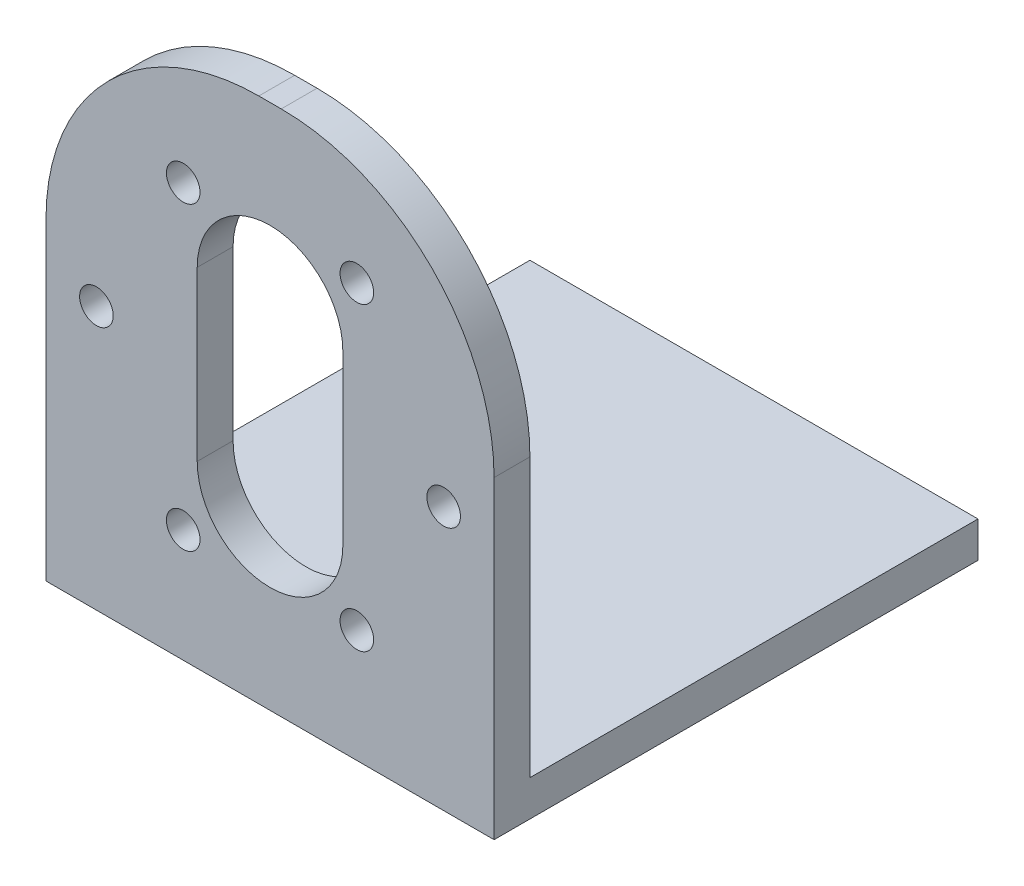
ISO-10303-21;
HEADER;
FILE_DESCRIPTION(('STEP AP214'),'2;1');
FILE_NAME('part.step','',(''),(''),'','','');
FILE_SCHEMA(('AUTOMOTIVE_DESIGN { 1 0 10303 214 1 1 1 1 }'));
ENDSEC;
DATA;
#1=APPLICATION_CONTEXT('core data for automotive mechanical design processes');
#2=APPLICATION_PROTOCOL_DEFINITION('international standard','automotive_design',2000,#1);
#3=PRODUCT_CONTEXT('',#1,'mechanical');
#4=PRODUCT('Part','Part','',(#3));
#5=PRODUCT_RELATED_PRODUCT_CATEGORY('part','',(#4));
#6=PRODUCT_DEFINITION_FORMATION('','',#4);
#7=PRODUCT_DEFINITION_CONTEXT('part definition',#1,'design');
#8=PRODUCT_DEFINITION('design','',#6,#7);
#9=PRODUCT_DEFINITION_SHAPE('','',#8);
#10=(LENGTH_UNIT() NAMED_UNIT(*) SI_UNIT(.MILLI.,.METRE.));
#11=(NAMED_UNIT(*) PLANE_ANGLE_UNIT() SI_UNIT($,.RADIAN.));
#12=(NAMED_UNIT(*) SI_UNIT($,.STERADIAN.) SOLID_ANGLE_UNIT());
#13=UNCERTAINTY_MEASURE_WITH_UNIT(LENGTH_MEASURE(1.E-05),#10,'distance_accuracy_value','');
#14=(GEOMETRIC_REPRESENTATION_CONTEXT(3) GLOBAL_UNCERTAINTY_ASSIGNED_CONTEXT((#13)) GLOBAL_UNIT_ASSIGNED_CONTEXT((#10,
#11,#12)) REPRESENTATION_CONTEXT('',''));
#15=CARTESIAN_POINT('',(0.,0.,0.));
#16=DIRECTION('',(0.,0.,1.));
#17=DIRECTION('',(1.,0.,0.));
#18=AXIS2_PLACEMENT_3D('',#15,#16,#17);
#19=CARTESIAN_POINT('',(-1.00000000000002,4.5,1.6));
#20=DIRECTION('',(0.,0.,-1.));
#21=DIRECTION('',(-1.,0.,0.));
#22=AXIS2_PLACEMENT_3D('',#19,#20,#21);
#23=PLANE('',#22);
#24=CARTESIAN_POINT('',(-7.74999999999999,-13.4233937586588,1.6));
#25=DIRECTION('',(0.,0.,1.));
#26=DIRECTION('',(1.,0.,0.));
#27=AXIS2_PLACEMENT_3D('',#24,#25,#26);
#28=CIRCLE('',#27,1.5);
#29=CARTESIAN_POINT('',(-6.24999999999999,-13.4233937586588,1.6));
#30=VERTEX_POINT('',#29);
#31=EDGE_CURVE('E211',#30,#30,#28,.T.);
#32=ORIENTED_EDGE('',*,*,#31,.F.);
#33=EDGE_LOOP('',(#32));
#34=FACE_BOUND('',#33,.T.);
#35=CARTESIAN_POINT('',(7.75000000000001,-13.4233937586588,1.6));
#36=DIRECTION('',(0.,0.,1.));
#37=DIRECTION('',(1.,0.,0.));
#38=AXIS2_PLACEMENT_3D('',#35,#36,#37);
#39=CIRCLE('',#38,1.5);
#40=CARTESIAN_POINT('',(9.25000000000001,-13.4233937586588,1.6));
#41=VERTEX_POINT('',#40);
#42=EDGE_CURVE('E219',#41,#41,#39,.T.);
#43=ORIENTED_EDGE('',*,*,#42,.F.);
#44=EDGE_LOOP('',(#43));
#45=FACE_BOUND('',#44,.T.);
#46=CARTESIAN_POINT('',(15.5,0.,1.6));
#47=DIRECTION('',(0.,0.,1.));
#48=DIRECTION('',(1.,0.,0.));
#49=AXIS2_PLACEMENT_3D('',#46,#47,#48);
#50=CIRCLE('',#49,1.5);
#51=CARTESIAN_POINT('',(17.,0.,1.6));
#52=VERTEX_POINT('',#51);
#53=EDGE_CURVE('E227',#52,#52,#50,.T.);
#54=ORIENTED_EDGE('',*,*,#53,.F.);
#55=EDGE_LOOP('',(#54));
#56=FACE_BOUND('',#55,.T.);
#57=CARTESIAN_POINT('',(7.75,13.4233937586588,1.6));
#58=DIRECTION('',(0.,0.,1.));
#59=DIRECTION('',(1.,0.,0.));
#60=AXIS2_PLACEMENT_3D('',#57,#58,#59);
#61=CIRCLE('',#60,1.5);
#62=CARTESIAN_POINT('',(9.25,13.4233937586588,1.6));
#63=VERTEX_POINT('',#62);
#64=EDGE_CURVE('E235',#63,#63,#61,.T.);
#65=ORIENTED_EDGE('',*,*,#64,.F.);
#66=EDGE_LOOP('',(#65));
#67=FACE_BOUND('',#66,.T.);
#68=CARTESIAN_POINT('',(-7.75,13.4233937586588,1.6));
#69=DIRECTION('',(0.,0.,1.));
#70=DIRECTION('',(1.,0.,0.));
#71=AXIS2_PLACEMENT_3D('',#68,#69,#70);
#72=CIRCLE('',#71,1.5);
#73=CARTESIAN_POINT('',(-6.25,13.4233937586588,1.6));
#74=VERTEX_POINT('',#73);
#75=EDGE_CURVE('E243',#74,#74,#72,.T.);
#76=ORIENTED_EDGE('',*,*,#75,.F.);
#77=EDGE_LOOP('',(#76));
#78=FACE_BOUND('',#77,.T.);
#79=CARTESIAN_POINT('',(-15.5,0.,1.6));
#80=DIRECTION('',(0.,0.,1.));
#81=DIRECTION('',(1.,0.,0.));
#82=AXIS2_PLACEMENT_3D('',#79,#80,#81);
#83=CIRCLE('',#82,1.5);
#84=CARTESIAN_POINT('',(-14.,0.,1.6));
#85=VERTEX_POINT('',#84);
#86=EDGE_CURVE('E251',#85,#85,#83,.T.);
#87=ORIENTED_EDGE('',*,*,#86,.F.);
#88=EDGE_LOOP('',(#87));
#89=FACE_BOUND('',#88,.T.);
#90=DIRECTION('',(0.,-1.,0.));
#91=VECTOR('',#90,1.);
#92=CARTESIAN_POINT('',(-20.,-23.5,1.6));
#93=LINE('',#92,#91);
#94=CARTESIAN_POINT('',(-20.,4.49999999999987,1.6));
#95=VERTEX_POINT('',#94);
#96=CARTESIAN_POINT('',(-20.,-23.5,1.6));
#97=VERTEX_POINT('',#96);
#98=EDGE_CURVE('E259',#95,#97,#93,.T.);
#99=ORIENTED_EDGE('',*,*,#98,.T.);
#100=DIRECTION('',(1.,0.,0.));
#101=VECTOR('',#100,1.);
#102=CARTESIAN_POINT('',(-20.,-23.5,1.6));
#103=LINE('',#102,#101);
#104=CARTESIAN_POINT('',(20.,-23.5,1.6));
#105=VERTEX_POINT('',#104);
#106=EDGE_CURVE('E263',#97,#105,#103,.T.);
#107=ORIENTED_EDGE('',*,*,#106,.T.);
#108=DIRECTION('',(0.,1.,0.));
#109=VECTOR('',#108,1.);
#110=CARTESIAN_POINT('',(20.,-23.5,1.6));
#111=LINE('',#110,#109);
#112=CARTESIAN_POINT('',(20.,4.49999999999986,1.6));
#113=VERTEX_POINT('',#112);
#114=EDGE_CURVE('E136',#105,#113,#111,.T.);
#115=ORIENTED_EDGE('',*,*,#114,.T.);
#116=CARTESIAN_POINT('',(0.99999999999999,4.5,1.6));
#117=DIRECTION('',(0.,0.,1.));
#118=DIRECTION('',(-1.,0.,0.));
#119=AXIS2_PLACEMENT_3D('',#116,#117,#118);
#120=CIRCLE('',#119,19.);
#121=CARTESIAN_POINT('',(0.99999999999985,23.5,1.6));
#122=VERTEX_POINT('',#121);
#123=EDGE_CURVE('E269',#113,#122,#120,.T.);
#124=ORIENTED_EDGE('',*,*,#123,.T.);
#125=DIRECTION('',(-1.,0.,0.));
#126=VECTOR('',#125,1.);
#127=CARTESIAN_POINT('',(-0.999999999999879,23.5,1.6));
#128=LINE('',#127,#126);
#129=CARTESIAN_POINT('',(-0.999999999999879,23.5,1.6));
#130=VERTEX_POINT('',#129);
#131=EDGE_CURVE('E272',#122,#130,#128,.T.);
#132=ORIENTED_EDGE('',*,*,#131,.T.);
#133=CARTESIAN_POINT('',(-1.00000000000002,4.5,1.6));
#134=DIRECTION('',(0.,0.,1.));
#135=DIRECTION('',(-1.,0.,0.));
#136=AXIS2_PLACEMENT_3D('',#133,#134,#135);
#137=CIRCLE('',#136,19.);
#138=EDGE_CURVE('E275',#130,#95,#137,.T.);
#139=ORIENTED_EDGE('',*,*,#138,.T.);
#140=EDGE_LOOP('',(#99,#107,#115,#124,#132,#139));
#141=FACE_BOUND('',#140,.T.);
#142=CARTESIAN_POINT('',(0.,7.5,1.6));
#143=DIRECTION('',(0.,0.,1.));
#144=DIRECTION('',(1.,0.,0.));
#145=AXIS2_PLACEMENT_3D('',#142,#143,#144);
#146=CIRCLE('',#145,6.5);
#147=CARTESIAN_POINT('',(6.5,7.5,1.6));
#148=VERTEX_POINT('',#147);
#149=CARTESIAN_POINT('',(-6.5,7.5,1.6));
#150=VERTEX_POINT('',#149);
#151=EDGE_CURVE('E170',#148,#150,#146,.T.);
#152=ORIENTED_EDGE('',*,*,#151,.F.);
#153=DIRECTION('',(0.,1.,0.));
#154=VECTOR('',#153,1.);
#155=CARTESIAN_POINT('',(6.5,7.5,1.6));
#156=LINE('',#155,#154);
#157=CARTESIAN_POINT('',(6.5,-7.5,1.6));
#158=VERTEX_POINT('',#157);
#159=EDGE_CURVE('E180',#158,#148,#156,.T.);
#160=ORIENTED_EDGE('',*,*,#159,.F.);
#161=CARTESIAN_POINT('',(0.,-7.5,1.6));
#162=DIRECTION('',(0.,0.,1.));
#163=DIRECTION('',(1.,0.,0.));
#164=AXIS2_PLACEMENT_3D('',#161,#162,#163);
#165=CIRCLE('',#164,6.5);
#166=CARTESIAN_POINT('',(-6.5,-7.5,1.6));
#167=VERTEX_POINT('',#166);
#168=EDGE_CURVE('E177',#167,#158,#165,.T.);
#169=ORIENTED_EDGE('',*,*,#168,.F.);
#170=DIRECTION('',(0.,-1.,0.));
#171=VECTOR('',#170,1.);
#172=CARTESIAN_POINT('',(-6.5,7.5,1.6));
#173=LINE('',#172,#171);
#174=EDGE_CURVE('E173',#150,#167,#173,.T.);
#175=ORIENTED_EDGE('',*,*,#174,.F.);
#176=EDGE_LOOP('',(#152,#160,#169,#175));
#177=FACE_BOUND('',#176,.T.);
#178=ADVANCED_FACE('F39',(#34,#45,#56,#67,#78,#89,#141,#177),#23,.F.);
#179=CARTESIAN_POINT('',(-1.00000000000002,4.5,-1.6));
#180=DIRECTION('',(0.,0.,-1.));
#181=DIRECTION('',(-1.,0.,0.));
#182=AXIS2_PLACEMENT_3D('',#179,#180,#181);
#183=PLANE('',#182);
#184=DIRECTION('',(1.,0.,0.));
#185=VECTOR('',#184,1.);
#186=CARTESIAN_POINT('',(20.,-20.3,-1.6));
#187=LINE('',#186,#185);
#188=CARTESIAN_POINT('',(-20.,-20.3,-1.6));
#189=VERTEX_POINT('',#188);
#190=CARTESIAN_POINT('',(20.,-20.3,-1.6));
#191=VERTEX_POINT('',#190);
#192=EDGE_CURVE('E55',#189,#191,#187,.T.);
#193=ORIENTED_EDGE('',*,*,#192,.F.);
#194=DIRECTION('',(0.,-1.,0.));
#195=VECTOR('',#194,1.);
#196=CARTESIAN_POINT('',(-20.,-23.5,-1.6));
#197=LINE('',#196,#195);
#198=CARTESIAN_POINT('',(-20.,4.49999999999987,-1.6));
#199=VERTEX_POINT('',#198);
#200=EDGE_CURVE('E255',#199,#189,#197,.T.);
#201=ORIENTED_EDGE('',*,*,#200,.F.);
#202=CARTESIAN_POINT('',(-1.00000000000002,4.5,-1.6));
#203=DIRECTION('',(0.,0.,1.));
#204=DIRECTION('',(-1.,0.,0.));
#205=AXIS2_PLACEMENT_3D('',#202,#203,#204);
#206=CIRCLE('',#205,19.);
#207=CARTESIAN_POINT('',(-0.999999999999879,23.5,-1.6));
#208=VERTEX_POINT('',#207);
#209=EDGE_CURVE('E264',#208,#199,#206,.T.);
#210=ORIENTED_EDGE('',*,*,#209,.F.);
#211=DIRECTION('',(-1.,0.,0.));
#212=VECTOR('',#211,1.);
#213=CARTESIAN_POINT('',(-0.999999999999879,23.5,-1.6));
#214=LINE('',#213,#212);
#215=CARTESIAN_POINT('',(0.99999999999985,23.5,-1.6));
#216=VERTEX_POINT('',#215);
#217=EDGE_CURVE('E287',#216,#208,#214,.T.);
#218=ORIENTED_EDGE('',*,*,#217,.F.);
#219=CARTESIAN_POINT('',(0.99999999999999,4.5,-1.6));
#220=DIRECTION('',(0.,0.,1.));
#221=DIRECTION('',(-1.,0.,0.));
#222=AXIS2_PLACEMENT_3D('',#219,#220,#221);
#223=CIRCLE('',#222,19.);
#224=CARTESIAN_POINT('',(20.,4.49999999999986,-1.6));
#225=VERTEX_POINT('',#224);
#226=EDGE_CURVE('E284',#225,#216,#223,.T.);
#227=ORIENTED_EDGE('',*,*,#226,.F.);
#228=DIRECTION('',(0.,1.,0.));
#229=VECTOR('',#228,1.);
#230=CARTESIAN_POINT('',(20.,-23.5,-1.6));
#231=LINE('',#230,#229);
#232=EDGE_CURVE('E281',#191,#225,#231,.T.);
#233=ORIENTED_EDGE('',*,*,#232,.F.);
#234=EDGE_LOOP('',(#193,#201,#210,#218,#227,#233));
#235=FACE_BOUND('',#234,.T.);
#236=CARTESIAN_POINT('',(7.75000000000001,-13.4233937586588,-1.6));
#237=DIRECTION('',(0.,0.,1.));
#238=DIRECTION('',(1.,0.,0.));
#239=AXIS2_PLACEMENT_3D('',#236,#237,#238);
#240=CIRCLE('',#239,1.5);
#241=CARTESIAN_POINT('',(9.25000000000001,-13.4233937586588,-1.6));
#242=VERTEX_POINT('',#241);
#243=EDGE_CURVE('E215',#242,#242,#240,.T.);
#244=ORIENTED_EDGE('',*,*,#243,.T.);
#245=EDGE_LOOP('',(#244));
#246=FACE_BOUND('',#245,.T.);
#247=CARTESIAN_POINT('',(7.75,13.4233937586588,-1.6));
#248=DIRECTION('',(0.,0.,1.));
#249=DIRECTION('',(1.,0.,0.));
#250=AXIS2_PLACEMENT_3D('',#247,#248,#249);
#251=CIRCLE('',#250,1.5);
#252=CARTESIAN_POINT('',(9.25,13.4233937586588,-1.6));
#253=VERTEX_POINT('',#252);
#254=EDGE_CURVE('E231',#253,#253,#251,.T.);
#255=ORIENTED_EDGE('',*,*,#254,.T.);
#256=EDGE_LOOP('',(#255));
#257=FACE_BOUND('',#256,.T.);
#258=CARTESIAN_POINT('',(-15.5,0.,-1.6));
#259=DIRECTION('',(0.,0.,1.));
#260=DIRECTION('',(1.,0.,0.));
#261=AXIS2_PLACEMENT_3D('',#258,#259,#260);
#262=CIRCLE('',#261,1.5);
#263=CARTESIAN_POINT('',(-14.,0.,-1.6));
#264=VERTEX_POINT('',#263);
#265=EDGE_CURVE('E247',#264,#264,#262,.T.);
#266=ORIENTED_EDGE('',*,*,#265,.T.);
#267=EDGE_LOOP('',(#266));
#268=FACE_BOUND('',#267,.T.);
#269=CARTESIAN_POINT('',(-7.75,13.4233937586588,-1.6));
#270=DIRECTION('',(0.,0.,1.));
#271=DIRECTION('',(1.,0.,0.));
#272=AXIS2_PLACEMENT_3D('',#269,#270,#271);
#273=CIRCLE('',#272,1.5);
#274=CARTESIAN_POINT('',(-6.25,13.4233937586588,-1.6));
#275=VERTEX_POINT('',#274);
#276=EDGE_CURVE('E239',#275,#275,#273,.T.);
#277=ORIENTED_EDGE('',*,*,#276,.T.);
#278=EDGE_LOOP('',(#277));
#279=FACE_BOUND('',#278,.T.);
#280=CARTESIAN_POINT('',(15.5,0.,-1.6));
#281=DIRECTION('',(0.,0.,1.));
#282=DIRECTION('',(1.,0.,0.));
#283=AXIS2_PLACEMENT_3D('',#280,#281,#282);
#284=CIRCLE('',#283,1.5);
#285=CARTESIAN_POINT('',(17.,0.,-1.6));
#286=VERTEX_POINT('',#285);
#287=EDGE_CURVE('E223',#286,#286,#284,.T.);
#288=ORIENTED_EDGE('',*,*,#287,.T.);
#289=EDGE_LOOP('',(#288));
#290=FACE_BOUND('',#289,.T.);
#291=CARTESIAN_POINT('',(-7.74999999999999,-13.4233937586588,-1.6));
#292=DIRECTION('',(0.,0.,1.));
#293=DIRECTION('',(1.,0.,0.));
#294=AXIS2_PLACEMENT_3D('',#291,#292,#293);
#295=CIRCLE('',#294,1.5);
#296=CARTESIAN_POINT('',(-6.24999999999999,-13.4233937586588,-1.6));
#297=VERTEX_POINT('',#296);
#298=EDGE_CURVE('E210',#297,#297,#295,.T.);
#299=ORIENTED_EDGE('',*,*,#298,.T.);
#300=EDGE_LOOP('',(#299));
#301=FACE_BOUND('',#300,.T.);
#302=DIRECTION('',(0.,1.,0.));
#303=VECTOR('',#302,1.);
#304=CARTESIAN_POINT('',(6.5,7.5,-1.6));
#305=LINE('',#304,#303);
#306=CARTESIAN_POINT('',(6.5,-7.5,-1.6));
#307=VERTEX_POINT('',#306);
#308=CARTESIAN_POINT('',(6.5,7.5,-1.6));
#309=VERTEX_POINT('',#308);
#310=EDGE_CURVE('E174',#307,#309,#305,.T.);
#311=ORIENTED_EDGE('',*,*,#310,.T.);
#312=CARTESIAN_POINT('',(0.,7.5,-1.6));
#313=DIRECTION('',(0.,0.,1.));
#314=DIRECTION('',(1.,0.,0.));
#315=AXIS2_PLACEMENT_3D('',#312,#313,#314);
#316=CIRCLE('',#315,6.5);
#317=CARTESIAN_POINT('',(-6.5,7.5,-1.6));
#318=VERTEX_POINT('',#317);
#319=EDGE_CURVE('E169',#309,#318,#316,.T.);
#320=ORIENTED_EDGE('',*,*,#319,.T.);
#321=DIRECTION('',(0.,-1.,0.));
#322=VECTOR('',#321,1.);
#323=CARTESIAN_POINT('',(-6.5,7.5,-1.6));
#324=LINE('',#323,#322);
#325=CARTESIAN_POINT('',(-6.5,-7.5,-1.6));
#326=VERTEX_POINT('',#325);
#327=EDGE_CURVE('E187',#318,#326,#324,.T.);
#328=ORIENTED_EDGE('',*,*,#327,.T.);
#329=CARTESIAN_POINT('',(0.,-7.5,-1.6));
#330=DIRECTION('',(0.,0.,1.));
#331=DIRECTION('',(1.,0.,0.));
#332=AXIS2_PLACEMENT_3D('',#329,#330,#331);
#333=CIRCLE('',#332,6.5);
#334=EDGE_CURVE('E191',#326,#307,#333,.T.);
#335=ORIENTED_EDGE('',*,*,#334,.T.);
#336=EDGE_LOOP('',(#311,#320,#328,#335));
#337=FACE_BOUND('',#336,.T.);
#338=ADVANCED_FACE('F311',(#235,#246,#257,#268,#279,#290,#301,#337),#183,.T.);
#339=CARTESIAN_POINT('',(-20.,-23.5,1.6));
#340=DIRECTION('',(1.,0.,0.));
#341=DIRECTION('',(0.,0.,-1.));
#342=AXIS2_PLACEMENT_3D('',#339,#340,#341);
#343=PLANE('',#342);
#344=ORIENTED_EDGE('',*,*,#200,.T.);
#345=DIRECTION('',(0.,0.,1.));
#346=VECTOR('',#345,1.);
#347=CARTESIAN_POINT('',(-20.,-20.3,-41.6));
#348=LINE('',#347,#346);
#349=CARTESIAN_POINT('',(-20.,-20.3,-41.6));
#350=VERTEX_POINT('',#349);
#351=EDGE_CURVE('E165',#350,#189,#348,.T.);
#352=ORIENTED_EDGE('',*,*,#351,.F.);
#353=DIRECTION('',(0.,1.,0.));
#354=VECTOR('',#353,1.);
#355=CARTESIAN_POINT('',(-20.,-23.5,-41.6));
#356=LINE('',#355,#354);
#357=CARTESIAN_POINT('',(-20.,-23.5,-41.6));
#358=VERTEX_POINT('',#357);
#359=EDGE_CURVE('E147',#358,#350,#356,.T.);
#360=ORIENTED_EDGE('',*,*,#359,.F.);
#361=DIRECTION('',(0.,0.,-1.));
#362=VECTOR('',#361,1.);
#363=CARTESIAN_POINT('',(-20.,-23.5,1.6));
#364=LINE('',#363,#362);
#365=EDGE_CURVE('E11',#97,#358,#364,.T.);
#366=ORIENTED_EDGE('',*,*,#365,.F.);
#367=ORIENTED_EDGE('',*,*,#98,.F.);
#368=DIRECTION('',(0.,0.,-1.));
#369=VECTOR('',#368,1.);
#370=CARTESIAN_POINT('',(-20.,4.49999999999987,1.6));
#371=LINE('',#370,#369);
#372=EDGE_CURVE('E278',#95,#199,#371,.T.);
#373=ORIENTED_EDGE('',*,*,#372,.T.);
#374=EDGE_LOOP('',(#344,#352,#360,#366,#367,#373));
#375=FACE_BOUND('',#374,.T.);
#376=ADVANCED_FACE('F41',(#375),#343,.F.);
#377=CARTESIAN_POINT('',(-20.,-23.5,1.6));
#378=DIRECTION('',(0.,1.,0.));
#379=DIRECTION('',(0.,0.,1.));
#380=AXIS2_PLACEMENT_3D('',#377,#378,#379);
#381=PLANE('',#380);
#382=ORIENTED_EDGE('',*,*,#365,.T.);
#383=DIRECTION('',(-1.,0.,0.));
#384=VECTOR('',#383,1.);
#385=CARTESIAN_POINT('',(20.,-23.5,-41.6));
#386=LINE('',#385,#384);
#387=CARTESIAN_POINT('',(20.,-23.5,-41.6));
#388=VERTEX_POINT('',#387);
#389=EDGE_CURVE('E141',#388,#358,#386,.T.);
#390=ORIENTED_EDGE('',*,*,#389,.F.);
#391=DIRECTION('',(0.,0.,-1.));
#392=VECTOR('',#391,1.);
#393=CARTESIAN_POINT('',(20.,-23.5,1.6));
#394=LINE('',#393,#392);
#395=EDGE_CURVE('E48',#105,#388,#394,.T.);
#396=ORIENTED_EDGE('',*,*,#395,.F.);
#397=ORIENTED_EDGE('',*,*,#106,.F.);
#398=EDGE_LOOP('',(#382,#390,#396,#397));
#399=FACE_BOUND('',#398,.T.);
#400=ADVANCED_FACE('F142',(#399),#381,.F.);
#401=CARTESIAN_POINT('',(20.,-23.5,1.6));
#402=DIRECTION('',(-1.,0.,0.));
#403=DIRECTION('',(0.,0.,1.));
#404=AXIS2_PLACEMENT_3D('',#401,#402,#403);
#405=PLANE('',#404);
#406=ORIENTED_EDGE('',*,*,#395,.T.);
#407=DIRECTION('',(0.,-1.,0.));
#408=VECTOR('',#407,1.);
#409=CARTESIAN_POINT('',(20.,-23.5,-41.6));
#410=LINE('',#409,#408);
#411=CARTESIAN_POINT('',(20.,-20.3,-41.6));
#412=VERTEX_POINT('',#411);
#413=EDGE_CURVE('E134',#412,#388,#410,.T.);
#414=ORIENTED_EDGE('',*,*,#413,.F.);
#415=DIRECTION('',(0.,0.,1.));
#416=VECTOR('',#415,1.);
#417=CARTESIAN_POINT('',(20.,-20.3,-41.6));
#418=LINE('',#417,#416);
#419=EDGE_CURVE('E161',#412,#191,#418,.T.);
#420=ORIENTED_EDGE('',*,*,#419,.T.);
#421=ORIENTED_EDGE('',*,*,#232,.T.);
#422=DIRECTION('',(0.,0.,-1.));
#423=VECTOR('',#422,1.);
#424=CARTESIAN_POINT('',(20.,4.49999999999986,1.6));
#425=LINE('',#424,#423);
#426=EDGE_CURVE('E139',#113,#225,#425,.T.);
#427=ORIENTED_EDGE('',*,*,#426,.F.);
#428=ORIENTED_EDGE('',*,*,#114,.F.);
#429=EDGE_LOOP('',(#406,#414,#420,#421,#427,#428));
#430=FACE_BOUND('',#429,.T.);
#431=ADVANCED_FACE('F131',(#430),#405,.F.);
#432=CARTESIAN_POINT('',(0.99999999999999,4.5,1.6));
#433=DIRECTION('',(0.,0.,-1.));
#434=DIRECTION('',(-1.,0.,0.));
#435=AXIS2_PLACEMENT_3D('',#432,#433,#434);
#436=CYLINDRICAL_SURFACE('',#435,19.);
#437=ORIENTED_EDGE('',*,*,#226,.T.);
#438=DIRECTION('',(0.,0.,-1.));
#439=VECTOR('',#438,1.);
#440=CARTESIAN_POINT('',(0.99999999999985,23.5,1.6));
#441=LINE('',#440,#439);
#442=EDGE_CURVE('E299',#122,#216,#441,.T.);
#443=ORIENTED_EDGE('',*,*,#442,.F.);
#444=ORIENTED_EDGE('',*,*,#123,.F.);
#445=ORIENTED_EDGE('',*,*,#426,.T.);
#446=EDGE_LOOP('',(#437,#443,#444,#445));
#447=FACE_BOUND('',#446,.T.);
#448=ADVANCED_FACE('F308',(#447),#436,.T.);
#449=CARTESIAN_POINT('',(-0.999999999999879,23.5,1.6));
#450=DIRECTION('',(0.,-1.,0.));
#451=DIRECTION('',(0.,0.,-1.));
#452=AXIS2_PLACEMENT_3D('',#449,#450,#451);
#453=PLANE('',#452);
#454=ORIENTED_EDGE('',*,*,#217,.T.);
#455=DIRECTION('',(0.,0.,-1.));
#456=VECTOR('',#455,1.);
#457=CARTESIAN_POINT('',(-0.999999999999879,23.5,1.6));
#458=LINE('',#457,#456);
#459=EDGE_CURVE('E295',#130,#208,#458,.T.);
#460=ORIENTED_EDGE('',*,*,#459,.F.);
#461=ORIENTED_EDGE('',*,*,#131,.F.);
#462=ORIENTED_EDGE('',*,*,#442,.T.);
#463=EDGE_LOOP('',(#454,#460,#461,#462));
#464=FACE_BOUND('',#463,.T.);
#465=ADVANCED_FACE('F316',(#464),#453,.F.);
#466=CARTESIAN_POINT('',(-1.00000000000002,4.5,1.6));
#467=DIRECTION('',(0.,0.,-1.));
#468=DIRECTION('',(-1.,0.,0.));
#469=AXIS2_PLACEMENT_3D('',#466,#467,#468);
#470=CYLINDRICAL_SURFACE('',#469,19.);
#471=ORIENTED_EDGE('',*,*,#209,.T.);
#472=ORIENTED_EDGE('',*,*,#372,.F.);
#473=ORIENTED_EDGE('',*,*,#138,.F.);
#474=ORIENTED_EDGE('',*,*,#459,.T.);
#475=EDGE_LOOP('',(#471,#472,#473,#474));
#476=FACE_BOUND('',#475,.T.);
#477=ADVANCED_FACE('F320',(#476),#470,.T.);
#478=CARTESIAN_POINT('',(-15.5,0.,1.6));
#479=DIRECTION('',(0.,0.,-1.));
#480=DIRECTION('',(-1.,0.,0.));
#481=AXIS2_PLACEMENT_3D('',#478,#479,#480);
#482=CYLINDRICAL_SURFACE('',#481,1.5);
#483=ORIENTED_EDGE('',*,*,#86,.T.);
#484=EDGE_LOOP('',(#483));
#485=FACE_BOUND('',#484,.T.);
#486=ORIENTED_EDGE('',*,*,#265,.F.);
#487=EDGE_LOOP('',(#486));
#488=FACE_BOUND('',#487,.T.);
#489=ADVANCED_FACE('F349',(#485,#488),#482,.F.);
#490=CARTESIAN_POINT('',(-7.75,13.4233937586588,1.6));
#491=DIRECTION('',(0.,0.,-1.));
#492=DIRECTION('',(-1.,0.,0.));
#493=AXIS2_PLACEMENT_3D('',#490,#491,#492);
#494=CYLINDRICAL_SURFACE('',#493,1.5);
#495=ORIENTED_EDGE('',*,*,#75,.T.);
#496=EDGE_LOOP('',(#495));
#497=FACE_BOUND('',#496,.T.);
#498=ORIENTED_EDGE('',*,*,#276,.F.);
#499=EDGE_LOOP('',(#498));
#500=FACE_BOUND('',#499,.T.);
#501=ADVANCED_FACE('F446',(#497,#500),#494,.F.);
#502=CARTESIAN_POINT('',(7.75,13.4233937586588,1.6));
#503=DIRECTION('',(0.,0.,-1.));
#504=DIRECTION('',(-1.,0.,0.));
#505=AXIS2_PLACEMENT_3D('',#502,#503,#504);
#506=CYLINDRICAL_SURFACE('',#505,1.5);
#507=ORIENTED_EDGE('',*,*,#64,.T.);
#508=EDGE_LOOP('',(#507));
#509=FACE_BOUND('',#508,.T.);
#510=ORIENTED_EDGE('',*,*,#254,.F.);
#511=EDGE_LOOP('',(#510));
#512=FACE_BOUND('',#511,.T.);
#513=ADVANCED_FACE('F436',(#509,#512),#506,.F.);
#514=CARTESIAN_POINT('',(15.5,0.,1.6));
#515=DIRECTION('',(0.,0.,-1.));
#516=DIRECTION('',(-1.,0.,0.));
#517=AXIS2_PLACEMENT_3D('',#514,#515,#516);
#518=CYLINDRICAL_SURFACE('',#517,1.5);
#519=ORIENTED_EDGE('',*,*,#53,.T.);
#520=EDGE_LOOP('',(#519));
#521=FACE_BOUND('',#520,.T.);
#522=ORIENTED_EDGE('',*,*,#287,.F.);
#523=EDGE_LOOP('',(#522));
#524=FACE_BOUND('',#523,.T.);
#525=ADVANCED_FACE('F426',(#521,#524),#518,.F.);
#526=CARTESIAN_POINT('',(7.75000000000001,-13.4233937586588,1.6));
#527=DIRECTION('',(0.,0.,-1.));
#528=DIRECTION('',(-1.,0.,0.));
#529=AXIS2_PLACEMENT_3D('',#526,#527,#528);
#530=CYLINDRICAL_SURFACE('',#529,1.5);
#531=ORIENTED_EDGE('',*,*,#42,.T.);
#532=EDGE_LOOP('',(#531));
#533=FACE_BOUND('',#532,.T.);
#534=ORIENTED_EDGE('',*,*,#243,.F.);
#535=EDGE_LOOP('',(#534));
#536=FACE_BOUND('',#535,.T.);
#537=ADVANCED_FACE('F416',(#533,#536),#530,.F.);
#538=CARTESIAN_POINT('',(-7.74999999999999,-13.4233937586588,1.6));
#539=DIRECTION('',(0.,0.,-1.));
#540=DIRECTION('',(-1.,0.,0.));
#541=AXIS2_PLACEMENT_3D('',#538,#539,#540);
#542=CYLINDRICAL_SURFACE('',#541,1.5);
#543=ORIENTED_EDGE('',*,*,#31,.T.);
#544=EDGE_LOOP('',(#543));
#545=FACE_BOUND('',#544,.T.);
#546=ORIENTED_EDGE('',*,*,#298,.F.);
#547=EDGE_LOOP('',(#546));
#548=FACE_BOUND('',#547,.T.);
#549=ADVANCED_FACE('F406',(#545,#548),#542,.F.);
#550=CARTESIAN_POINT('',(0.,7.5,1.6));
#551=DIRECTION('',(0.,0.,-1.));
#552=DIRECTION('',(-1.,0.,0.));
#553=AXIS2_PLACEMENT_3D('',#550,#551,#552);
#554=CYLINDRICAL_SURFACE('',#553,6.5);
#555=ORIENTED_EDGE('',*,*,#319,.F.);
#556=DIRECTION('',(0.,0.,-1.));
#557=VECTOR('',#556,1.);
#558=CARTESIAN_POINT('',(6.5,7.5,1.6));
#559=LINE('',#558,#557);
#560=EDGE_CURVE('E183',#148,#309,#559,.T.);
#561=ORIENTED_EDGE('',*,*,#560,.F.);
#562=ORIENTED_EDGE('',*,*,#151,.T.);
#563=DIRECTION('',(0.,0.,-1.));
#564=VECTOR('',#563,1.);
#565=CARTESIAN_POINT('',(-6.5,7.5,1.6));
#566=LINE('',#565,#564);
#567=EDGE_CURVE('E206',#150,#318,#566,.T.);
#568=ORIENTED_EDGE('',*,*,#567,.T.);
#569=EDGE_LOOP('',(#555,#561,#562,#568));
#570=FACE_BOUND('',#569,.T.);
#571=ADVANCED_FACE('F396',(#570),#554,.F.);
#572=CARTESIAN_POINT('',(-6.5,7.5,1.6));
#573=DIRECTION('',(1.,0.,0.));
#574=DIRECTION('',(0.,0.,-1.));
#575=AXIS2_PLACEMENT_3D('',#572,#573,#574);
#576=PLANE('',#575);
#577=ORIENTED_EDGE('',*,*,#327,.F.);
#578=ORIENTED_EDGE('',*,*,#567,.F.);
#579=ORIENTED_EDGE('',*,*,#174,.T.);
#580=DIRECTION('',(0.,0.,-1.));
#581=VECTOR('',#580,1.);
#582=CARTESIAN_POINT('',(-6.5,-7.5,1.6));
#583=LINE('',#582,#581);
#584=EDGE_CURVE('E203',#167,#326,#583,.T.);
#585=ORIENTED_EDGE('',*,*,#584,.T.);
#586=EDGE_LOOP('',(#577,#578,#579,#585));
#587=FACE_BOUND('',#586,.T.);
#588=ADVANCED_FACE('F386',(#587),#576,.T.);
#589=CARTESIAN_POINT('',(0.,-7.5,1.6));
#590=DIRECTION('',(0.,0.,-1.));
#591=DIRECTION('',(-1.,0.,0.));
#592=AXIS2_PLACEMENT_3D('',#589,#590,#591);
#593=CYLINDRICAL_SURFACE('',#592,6.5);
#594=ORIENTED_EDGE('',*,*,#334,.F.);
#595=ORIENTED_EDGE('',*,*,#584,.F.);
#596=ORIENTED_EDGE('',*,*,#168,.T.);
#597=DIRECTION('',(0.,0.,-1.));
#598=VECTOR('',#597,1.);
#599=CARTESIAN_POINT('',(6.5,-7.5,1.6));
#600=LINE('',#599,#598);
#601=EDGE_CURVE('E63',#158,#307,#600,.T.);
#602=ORIENTED_EDGE('',*,*,#601,.T.);
#603=EDGE_LOOP('',(#594,#595,#596,#602));
#604=FACE_BOUND('',#603,.T.);
#605=ADVANCED_FACE('F337',(#604),#593,.F.);
#606=CARTESIAN_POINT('',(6.5,7.5,1.6));
#607=DIRECTION('',(-1.,0.,0.));
#608=DIRECTION('',(0.,0.,1.));
#609=AXIS2_PLACEMENT_3D('',#606,#607,#608);
#610=PLANE('',#609);
#611=ORIENTED_EDGE('',*,*,#310,.F.);
#612=ORIENTED_EDGE('',*,*,#601,.F.);
#613=ORIENTED_EDGE('',*,*,#159,.T.);
#614=ORIENTED_EDGE('',*,*,#560,.T.);
#615=EDGE_LOOP('',(#611,#612,#613,#614));
#616=FACE_BOUND('',#615,.T.);
#617=ADVANCED_FACE('F330',(#616),#610,.T.);
#618=CARTESIAN_POINT('',(20.,-20.3,-41.6));
#619=DIRECTION('',(0.,-1.,0.));
#620=DIRECTION('',(0.,0.,-1.));
#621=AXIS2_PLACEMENT_3D('',#618,#619,#620);
#622=PLANE('',#621);
#623=ORIENTED_EDGE('',*,*,#192,.T.);
#624=ORIENTED_EDGE('',*,*,#419,.F.);
#625=DIRECTION('',(1.,0.,0.));
#626=VECTOR('',#625,1.);
#627=CARTESIAN_POINT('',(20.,-20.3,-41.6));
#628=LINE('',#627,#626);
#629=EDGE_CURVE('E151',#350,#412,#628,.T.);
#630=ORIENTED_EDGE('',*,*,#629,.F.);
#631=ORIENTED_EDGE('',*,*,#351,.T.);
#632=EDGE_LOOP('',(#623,#624,#630,#631));
#633=FACE_BOUND('',#632,.T.);
#634=ADVANCED_FACE('F328',(#633),#622,.F.);
#635=CARTESIAN_POINT('',(0.,0.,-41.6));
#636=DIRECTION('',(0.,0.,1.));
#637=DIRECTION('',(1.,0.,0.));
#638=AXIS2_PLACEMENT_3D('',#635,#636,#637);
#639=PLANE('',#638);
#640=ORIENTED_EDGE('',*,*,#413,.T.);
#641=ORIENTED_EDGE('',*,*,#389,.T.);
#642=ORIENTED_EDGE('',*,*,#359,.T.);
#643=ORIENTED_EDGE('',*,*,#629,.T.);
#644=EDGE_LOOP('',(#640,#641,#642,#643));
#645=FACE_BOUND('',#644,.T.);
#646=ADVANCED_FACE('F149',(#645),#639,.F.);
#647=CLOSED_SHELL('',(#178,#338,#376,#400,#431,#448,#465,#477,#489,#501,#513,#525,#537,#549,
#571,#588,#605,#617,#634,#646));
#648=MANIFOLD_SOLID_BREP('B2',#647);
#649=ADVANCED_BREP_SHAPE_REPRESENTATION('',(#18,#648),#14);
#650=SHAPE_DEFINITION_REPRESENTATION(#9,#649);
ENDSEC;
END-ISO-10303-21;
